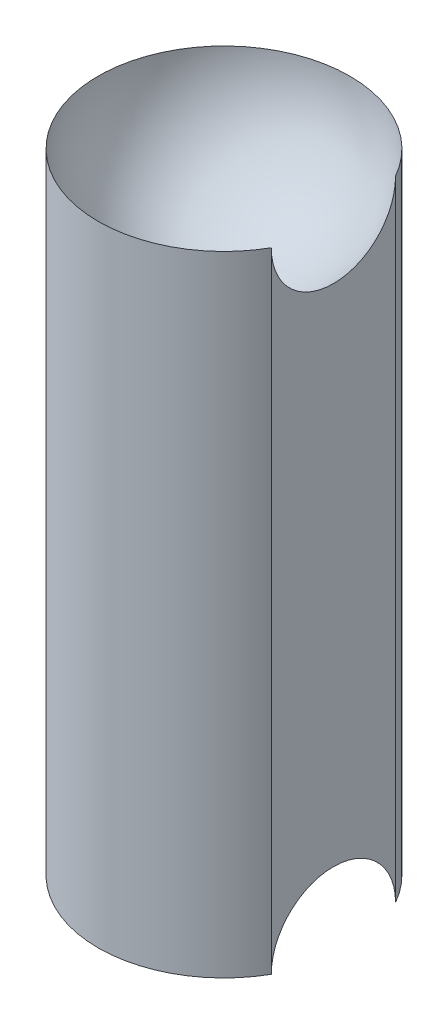
ISO-10303-21;
HEADER;
FILE_DESCRIPTION(('STEP AP214'),'2;1');
FILE_NAME('part.step','',(''),(''),'','','');
FILE_SCHEMA(('AUTOMOTIVE_DESIGN { 1 0 10303 214 1 1 1 1 }'));
ENDSEC;
DATA;
#1=APPLICATION_CONTEXT('core data for automotive mechanical design processes');
#2=APPLICATION_PROTOCOL_DEFINITION('international standard','automotive_design',2000,#1);
#3=PRODUCT_CONTEXT('',#1,'mechanical');
#4=PRODUCT('Part','Part','',(#3));
#5=PRODUCT_RELATED_PRODUCT_CATEGORY('part','',(#4));
#6=PRODUCT_DEFINITION_FORMATION('','',#4);
#7=PRODUCT_DEFINITION_CONTEXT('part definition',#1,'design');
#8=PRODUCT_DEFINITION('design','',#6,#7);
#9=PRODUCT_DEFINITION_SHAPE('','',#8);
#10=(LENGTH_UNIT() NAMED_UNIT(*) SI_UNIT(.MILLI.,.METRE.));
#11=(NAMED_UNIT(*) PLANE_ANGLE_UNIT() SI_UNIT($,.RADIAN.));
#12=(NAMED_UNIT(*) SI_UNIT($,.STERADIAN.) SOLID_ANGLE_UNIT());
#13=UNCERTAINTY_MEASURE_WITH_UNIT(LENGTH_MEASURE(1.E-05),#10,'distance_accuracy_value','');
#14=(GEOMETRIC_REPRESENTATION_CONTEXT(3) GLOBAL_UNCERTAINTY_ASSIGNED_CONTEXT((#13)) GLOBAL_UNIT_ASSIGNED_CONTEXT((#10,
#11,#12)) REPRESENTATION_CONTEXT('',''));
#15=CARTESIAN_POINT('',(0.,0.,0.));
#16=DIRECTION('',(0.,0.,1.));
#17=DIRECTION('',(1.,0.,0.));
#18=AXIS2_PLACEMENT_3D('',#15,#16,#17);
#19=CARTESIAN_POINT('',(0.,250.,0.));
#20=DIRECTION('',(0.,-1.,0.));
#21=DIRECTION('',(0.,0.,-1.));
#22=AXIS2_PLACEMENT_3D('',#19,#20,#21);
#23=CYLINDRICAL_SURFACE('',#22,50.);
#24=CARTESIAN_POINT('',(0.,250.,0.));
#25=DIRECTION('',(0.,1.,0.));
#26=DIRECTION('',(0.,0.,1.));
#27=AXIS2_PLACEMENT_3D('',#24,#25,#26);
#28=CIRCLE('',#27,50.);
#29=CARTESIAN_POINT('',(43.4815781280723,250.,24.6850635707575));
#30=VERTEX_POINT('',#29);
#31=CARTESIAN_POINT('',(43.4815781280723,250.,-24.6850635707575));
#32=VERTEX_POINT('',#31);
#33=EDGE_CURVE('E41',#30,#32,#28,.F.);
#34=ORIENTED_EDGE('',*,*,#33,.T.);
#35=DIRECTION('',(0.,-1.,0.));
#36=VECTOR('',#35,1.);
#37=CARTESIAN_POINT('',(43.4815781280723,250.,-24.6850635707575));
#38=LINE('',#37,#36);
#39=CARTESIAN_POINT('',(43.4815781280723,0.,-24.6850635707575));
#40=VERTEX_POINT('',#39);
#41=EDGE_CURVE('E52',#32,#40,#38,.T.);
#42=ORIENTED_EDGE('',*,*,#41,.T.);
#43=CARTESIAN_POINT('',(0.,0.,0.));
#44=DIRECTION('',(0.,1.,0.));
#45=DIRECTION('',(0.,0.,1.));
#46=AXIS2_PLACEMENT_3D('',#43,#44,#45);
#47=CIRCLE('',#46,50.);
#48=CARTESIAN_POINT('',(43.4815781280723,0.,24.6850635707575));
#49=VERTEX_POINT('',#48);
#50=EDGE_CURVE('E63',#49,#40,#47,.F.);
#51=ORIENTED_EDGE('',*,*,#50,.F.);
#52=DIRECTION('',(0.,-1.,0.));
#53=VECTOR('',#52,1.);
#54=CARTESIAN_POINT('',(43.4815781280723,250.,24.6850635707575));
#55=LINE('',#54,#53);
#56=EDGE_CURVE('E47',#49,#30,#55,.F.);
#57=ORIENTED_EDGE('',*,*,#56,.T.);
#58=EDGE_LOOP('',(#34,#42,#51,#57));
#59=FACE_BOUND('',#58,.T.);
#60=ADVANCED_FACE('F34',(#59),#23,.T.);
#61=CARTESIAN_POINT('',(0.,250.,0.));
#62=DIRECTION('',(0.,1.,0.));
#63=DIRECTION('',(1.,0.,0.));
#64=AXIS2_PLACEMENT_3D('',#61,#62,#63);
#65=SPHERICAL_SURFACE('',#64,50.);
#66=CARTESIAN_POINT('',(43.4815781280723,250.,0.));
#67=DIRECTION('',(-1.,0.,0.));
#68=DIRECTION('',(0.,0.,1.));
#69=AXIS2_PLACEMENT_3D('',#66,#67,#68);
#70=CIRCLE('',#69,24.6850635707575);
#71=EDGE_CURVE('E65',#32,#30,#70,.T.);
#72=ORIENTED_EDGE('',*,*,#71,.F.);
#73=ORIENTED_EDGE('',*,*,#33,.F.);
#74=EDGE_LOOP('',(#72,#73));
#75=FACE_BOUND('',#74,.T.);
#76=ADVANCED_FACE('F72',(#75),#65,.F.);
#77=CARTESIAN_POINT('',(0.,0.,0.));
#78=DIRECTION('',(0.,-1.,0.));
#79=DIRECTION('',(1.,0.,0.));
#80=AXIS2_PLACEMENT_3D('',#77,#78,#79);
#81=SPHERICAL_SURFACE('',#80,50.);
#82=CARTESIAN_POINT('',(43.4815781280723,0.,0.));
#83=DIRECTION('',(-1.,0.,0.));
#84=DIRECTION('',(0.,0.,1.));
#85=AXIS2_PLACEMENT_3D('',#82,#83,#84);
#86=CIRCLE('',#85,24.6850635707575);
#87=EDGE_CURVE('E11',#49,#40,#86,.T.);
#88=ORIENTED_EDGE('',*,*,#87,.F.);
#89=ORIENTED_EDGE('',*,*,#50,.T.);
#90=EDGE_LOOP('',(#88,#89));
#91=FACE_BOUND('',#90,.T.);
#92=ADVANCED_FACE('F67',(#91),#81,.F.);
#93=CARTESIAN_POINT('',(43.4815781280723,255.981543990737,-50.));
#94=DIRECTION('',(-1.,0.,0.));
#95=DIRECTION('',(0.,0.,1.));
#96=AXIS2_PLACEMENT_3D('',#93,#94,#95);
#97=PLANE('',#96);
#98=ORIENTED_EDGE('',*,*,#71,.T.);
#99=ORIENTED_EDGE('',*,*,#56,.F.);
#100=ORIENTED_EDGE('',*,*,#87,.T.);
#101=ORIENTED_EDGE('',*,*,#41,.F.);
#102=EDGE_LOOP('',(#98,#99,#100,#101));
#103=FACE_BOUND('',#102,.T.);
#104=ADVANCED_FACE('F57',(#103),#97,.F.);
#105=CLOSED_SHELL('',(#60,#76,#92,#104));
#106=MANIFOLD_SOLID_BREP('B2',#105);
#107=ADVANCED_BREP_SHAPE_REPRESENTATION('',(#18,#106),#14);
#108=SHAPE_DEFINITION_REPRESENTATION(#9,#107);
ENDSEC;
END-ISO-10303-21;
